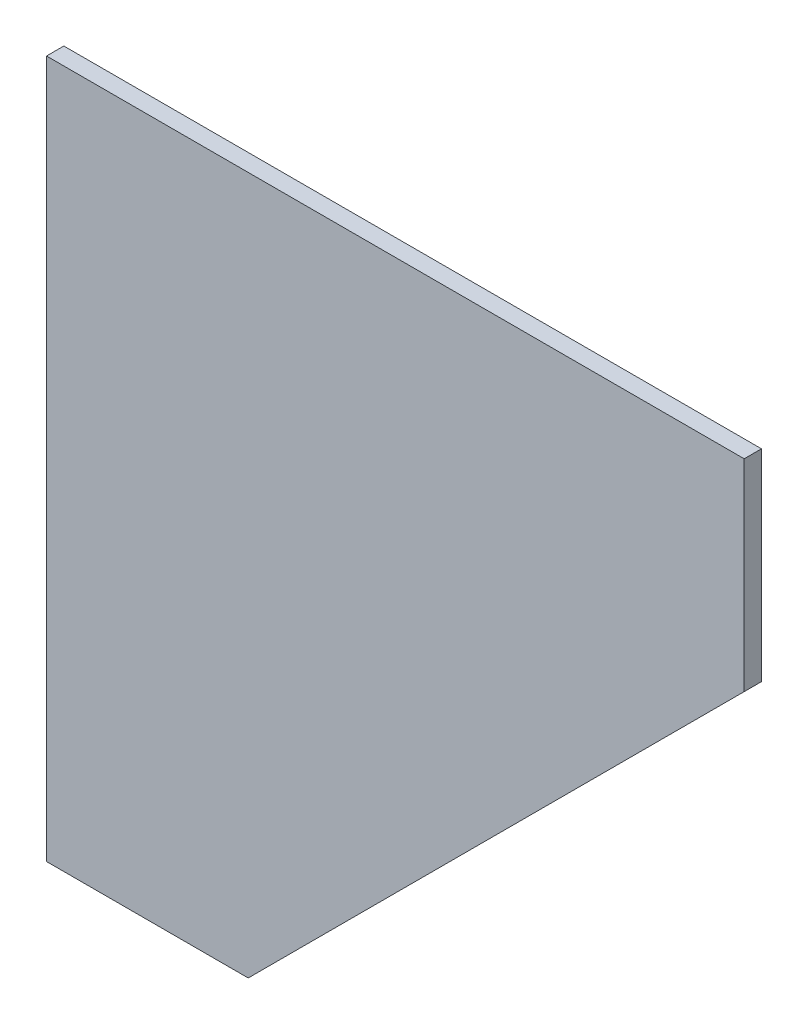
ISO-10303-21;
HEADER;
FILE_DESCRIPTION(('STEP AP214'),'2;1');
FILE_NAME('part.step','',(''),(''),'','','');
FILE_SCHEMA(('AUTOMOTIVE_DESIGN { 1 0 10303 214 1 1 1 1 }'));
ENDSEC;
DATA;
#1=APPLICATION_CONTEXT('core data for automotive mechanical design processes');
#2=APPLICATION_PROTOCOL_DEFINITION('international standard','automotive_design',2000,#1);
#3=PRODUCT_CONTEXT('',#1,'mechanical');
#4=PRODUCT('Part','Part','',(#3));
#5=PRODUCT_RELATED_PRODUCT_CATEGORY('part','',(#4));
#6=PRODUCT_DEFINITION_FORMATION('','',#4);
#7=PRODUCT_DEFINITION_CONTEXT('part definition',#1,'design');
#8=PRODUCT_DEFINITION('design','',#6,#7);
#9=PRODUCT_DEFINITION_SHAPE('','',#8);
#10=(LENGTH_UNIT() NAMED_UNIT(*) SI_UNIT(.MILLI.,.METRE.));
#11=(NAMED_UNIT(*) PLANE_ANGLE_UNIT() SI_UNIT($,.RADIAN.));
#12=(NAMED_UNIT(*) SI_UNIT($,.STERADIAN.) SOLID_ANGLE_UNIT());
#13=UNCERTAINTY_MEASURE_WITH_UNIT(LENGTH_MEASURE(1.E-05),#10,'distance_accuracy_value','');
#14=(GEOMETRIC_REPRESENTATION_CONTEXT(3) GLOBAL_UNCERTAINTY_ASSIGNED_CONTEXT((#13)) GLOBAL_UNIT_ASSIGNED_CONTEXT((#10,
#11,#12)) REPRESENTATION_CONTEXT('',''));
#15=CARTESIAN_POINT('',(0.,0.,0.));
#16=DIRECTION('',(0.,0.,1.));
#17=DIRECTION('',(1.,0.,0.));
#18=AXIS2_PLACEMENT_3D('',#15,#16,#17);
#19=CARTESIAN_POINT('',(292.132034355963,-120.,-6.));
#20=DIRECTION('',(1.,0.,0.));
#21=DIRECTION('',(0.,0.,-1.));
#22=AXIS2_PLACEMENT_3D('',#19,#20,#21);
#23=PLANE('',#22);
#24=DIRECTION('',(0.,1.,0.));
#25=VECTOR('',#24,1.);
#26=CARTESIAN_POINT('',(292.132034355963,-120.,0.));
#27=LINE('',#26,#25);
#28=CARTESIAN_POINT('',(292.132034355963,-120.,0.));
#29=VERTEX_POINT('',#28);
#30=CARTESIAN_POINT('',(292.132034355963,-49.9999999999996,0.));
#31=VERTEX_POINT('',#30);
#32=EDGE_CURVE('E113',#29,#31,#27,.T.);
#33=ORIENTED_EDGE('',*,*,#32,.F.);
#34=DIRECTION('',(0.,0.,1.));
#35=VECTOR('',#34,1.);
#36=CARTESIAN_POINT('',(292.132034355963,-120.,-6.));
#37=LINE('',#36,#35);
#38=CARTESIAN_POINT('',(292.132034355963,-120.,-6.));
#39=VERTEX_POINT('',#38);
#40=EDGE_CURVE('E11',#39,#29,#37,.T.);
#41=ORIENTED_EDGE('',*,*,#40,.F.);
#42=DIRECTION('',(0.,1.,0.));
#43=VECTOR('',#42,1.);
#44=CARTESIAN_POINT('',(292.132034355963,-120.,-6.));
#45=LINE('',#44,#43);
#46=CARTESIAN_POINT('',(292.132034355963,-49.9999999999996,-6.));
#47=VERTEX_POINT('',#46);
#48=EDGE_CURVE('E108',#39,#47,#45,.T.);
#49=ORIENTED_EDGE('',*,*,#48,.T.);
#50=DIRECTION('',(0.,0.,1.));
#51=VECTOR('',#50,1.);
#52=CARTESIAN_POINT('',(292.132034355963,-49.9999999999996,-6.));
#53=LINE('',#52,#51);
#54=EDGE_CURVE('E39',#47,#31,#53,.T.);
#55=ORIENTED_EDGE('',*,*,#54,.T.);
#56=EDGE_LOOP('',(#33,#41,#49,#55));
#57=FACE_BOUND('',#56,.T.);
#58=ADVANCED_FACE('F36',(#57),#23,.T.);
#59=CARTESIAN_POINT('',(120.000000000001,-292.132034355962,-6.));
#60=DIRECTION('',(0.707106781186548,-0.707106781186548,0.));
#61=DIRECTION('',(0.707106781186548,0.707106781186548,0.));
#62=AXIS2_PLACEMENT_3D('',#59,#60,#61);
#63=PLANE('',#62);
#64=DIRECTION('',(0.707106781186547,0.707106781186547,0.));
#65=VECTOR('',#64,1.);
#66=CARTESIAN_POINT('',(120.000000000001,-292.132034355962,0.));
#67=LINE('',#66,#65);
#68=CARTESIAN_POINT('',(120.000000000001,-292.132034355962,0.));
#69=VERTEX_POINT('',#68);
#70=EDGE_CURVE('E122',#69,#29,#67,.T.);
#71=ORIENTED_EDGE('',*,*,#70,.F.);
#72=DIRECTION('',(0.,0.,1.));
#73=VECTOR('',#72,1.);
#74=CARTESIAN_POINT('',(120.000000000001,-292.132034355962,-6.));
#75=LINE('',#74,#73);
#76=CARTESIAN_POINT('',(120.000000000001,-292.132034355962,-6.));
#77=VERTEX_POINT('',#76);
#78=EDGE_CURVE('E45',#77,#69,#75,.T.);
#79=ORIENTED_EDGE('',*,*,#78,.F.);
#80=DIRECTION('',(0.707106781186547,0.707106781186547,0.));
#81=VECTOR('',#80,1.);
#82=CARTESIAN_POINT('',(120.000000000001,-292.132034355962,-6.));
#83=LINE('',#82,#81);
#84=EDGE_CURVE('E103',#77,#39,#83,.T.);
#85=ORIENTED_EDGE('',*,*,#84,.T.);
#86=ORIENTED_EDGE('',*,*,#40,.T.);
#87=EDGE_LOOP('',(#71,#79,#85,#86));
#88=FACE_BOUND('',#87,.T.);
#89=ADVANCED_FACE('F128',(#88),#63,.T.);
#90=CARTESIAN_POINT('',(50.0000000000007,-292.132034355962,-6.));
#91=DIRECTION('',(0.,-1.,0.));
#92=DIRECTION('',(0.,0.,-1.));
#93=AXIS2_PLACEMENT_3D('',#90,#91,#92);
#94=PLANE('',#93);
#95=DIRECTION('',(1.,0.,0.));
#96=VECTOR('',#95,1.);
#97=CARTESIAN_POINT('',(50.0000000000007,-292.132034355962,0.));
#98=LINE('',#97,#96);
#99=CARTESIAN_POINT('',(50.0000000000007,-292.132034355962,0.));
#100=VERTEX_POINT('',#99);
#101=EDGE_CURVE('E92',#100,#69,#98,.T.);
#102=ORIENTED_EDGE('',*,*,#101,.F.);
#103=DIRECTION('',(0.,0.,1.));
#104=VECTOR('',#103,1.);
#105=CARTESIAN_POINT('',(50.0000000000007,-292.132034355962,-6.));
#106=LINE('',#105,#104);
#107=CARTESIAN_POINT('',(50.0000000000007,-292.132034355962,-6.));
#108=VERTEX_POINT('',#107);
#109=EDGE_CURVE('E87',#108,#100,#106,.T.);
#110=ORIENTED_EDGE('',*,*,#109,.F.);
#111=DIRECTION('',(1.,0.,0.));
#112=VECTOR('',#111,1.);
#113=CARTESIAN_POINT('',(50.0000000000007,-292.132034355962,-6.));
#114=LINE('',#113,#112);
#115=EDGE_CURVE('E90',#108,#77,#114,.T.);
#116=ORIENTED_EDGE('',*,*,#115,.T.);
#117=ORIENTED_EDGE('',*,*,#78,.T.);
#118=EDGE_LOOP('',(#102,#110,#116,#117));
#119=FACE_BOUND('',#118,.T.);
#120=ADVANCED_FACE('F89',(#119),#94,.T.);
#121=CARTESIAN_POINT('',(50.0000000000007,-49.9999999999997,-6.));
#122=DIRECTION('',(-1.,0.,0.));
#123=DIRECTION('',(0.,-1.,0.));
#124=AXIS2_PLACEMENT_3D('',#121,#122,#123);
#125=PLANE('',#124);
#126=DIRECTION('',(0.,-1.,0.));
#127=VECTOR('',#126,1.);
#128=CARTESIAN_POINT('',(50.0000000000007,-49.9999999999997,0.));
#129=LINE('',#128,#127);
#130=CARTESIAN_POINT('',(50.0000000000007,-49.9999999999997,0.));
#131=VERTEX_POINT('',#130);
#132=EDGE_CURVE('E119',#131,#100,#129,.T.);
#133=ORIENTED_EDGE('',*,*,#132,.F.);
#134=DIRECTION('',(0.,0.,1.));
#135=VECTOR('',#134,1.);
#136=CARTESIAN_POINT('',(50.0000000000007,-49.9999999999997,-6.));
#137=LINE('',#136,#135);
#138=CARTESIAN_POINT('',(50.0000000000007,-49.9999999999997,-6.));
#139=VERTEX_POINT('',#138);
#140=EDGE_CURVE('E97',#139,#131,#137,.T.);
#141=ORIENTED_EDGE('',*,*,#140,.F.);
#142=DIRECTION('',(0.,-1.,0.));
#143=VECTOR('',#142,1.);
#144=CARTESIAN_POINT('',(50.0000000000007,-49.9999999999997,-6.));
#145=LINE('',#144,#143);
#146=EDGE_CURVE('E102',#139,#108,#145,.T.);
#147=ORIENTED_EDGE('',*,*,#146,.T.);
#148=ORIENTED_EDGE('',*,*,#109,.T.);
#149=EDGE_LOOP('',(#133,#141,#147,#148));
#150=FACE_BOUND('',#149,.T.);
#151=ADVANCED_FACE('F105',(#150),#125,.T.);
#152=CARTESIAN_POINT('',(292.132034355963,-49.9999999999996,-6.));
#153=DIRECTION('',(0.,1.,0.));
#154=DIRECTION('',(-1.,0.,0.));
#155=AXIS2_PLACEMENT_3D('',#152,#153,#154);
#156=PLANE('',#155);
#157=DIRECTION('',(-1.,0.,0.));
#158=VECTOR('',#157,1.);
#159=CARTESIAN_POINT('',(292.132034355963,-49.9999999999996,0.));
#160=LINE('',#159,#158);
#161=EDGE_CURVE('E116',#31,#131,#160,.T.);
#162=ORIENTED_EDGE('',*,*,#161,.F.);
#163=ORIENTED_EDGE('',*,*,#54,.F.);
#164=DIRECTION('',(-1.,0.,0.));
#165=VECTOR('',#164,1.);
#166=CARTESIAN_POINT('',(292.132034355963,-49.9999999999996,-6.));
#167=LINE('',#166,#165);
#168=EDGE_CURVE('E106',#47,#139,#167,.T.);
#169=ORIENTED_EDGE('',*,*,#168,.T.);
#170=ORIENTED_EDGE('',*,*,#140,.T.);
#171=EDGE_LOOP('',(#162,#163,#169,#170));
#172=FACE_BOUND('',#171,.T.);
#173=ADVANCED_FACE('F125',(#172),#156,.T.);
#174=CARTESIAN_POINT('',(0.,0.,-6.));
#175=DIRECTION('',(0.,0.,1.));
#176=DIRECTION('',(1.,0.,0.));
#177=AXIS2_PLACEMENT_3D('',#174,#175,#176);
#178=PLANE('',#177);
#179=ORIENTED_EDGE('',*,*,#48,.F.);
#180=ORIENTED_EDGE('',*,*,#84,.F.);
#181=ORIENTED_EDGE('',*,*,#115,.F.);
#182=ORIENTED_EDGE('',*,*,#146,.F.);
#183=ORIENTED_EDGE('',*,*,#168,.F.);
#184=EDGE_LOOP('',(#179,#180,#181,#182,#183));
#185=FACE_BOUND('',#184,.T.);
#186=ADVANCED_FACE('F101',(#185),#178,.F.);
#187=CARTESIAN_POINT('',(0.,0.,0.));
#188=DIRECTION('',(0.,0.,1.));
#189=DIRECTION('',(1.,0.,0.));
#190=AXIS2_PLACEMENT_3D('',#187,#188,#189);
#191=PLANE('',#190);
#192=ORIENTED_EDGE('',*,*,#32,.T.);
#193=ORIENTED_EDGE('',*,*,#161,.T.);
#194=ORIENTED_EDGE('',*,*,#132,.T.);
#195=ORIENTED_EDGE('',*,*,#101,.T.);
#196=ORIENTED_EDGE('',*,*,#70,.T.);
#197=EDGE_LOOP('',(#192,#193,#194,#195,#196));
#198=FACE_BOUND('',#197,.T.);
#199=ADVANCED_FACE('F127',(#198),#191,.T.);
#200=CLOSED_SHELL('',(#58,#89,#120,#151,#173,#186,#199));
#201=MANIFOLD_SOLID_BREP('B2',#200);
#202=ADVANCED_BREP_SHAPE_REPRESENTATION('',(#18,#201),#14);
#203=SHAPE_DEFINITION_REPRESENTATION(#9,#202);
ENDSEC;
END-ISO-10303-21;
